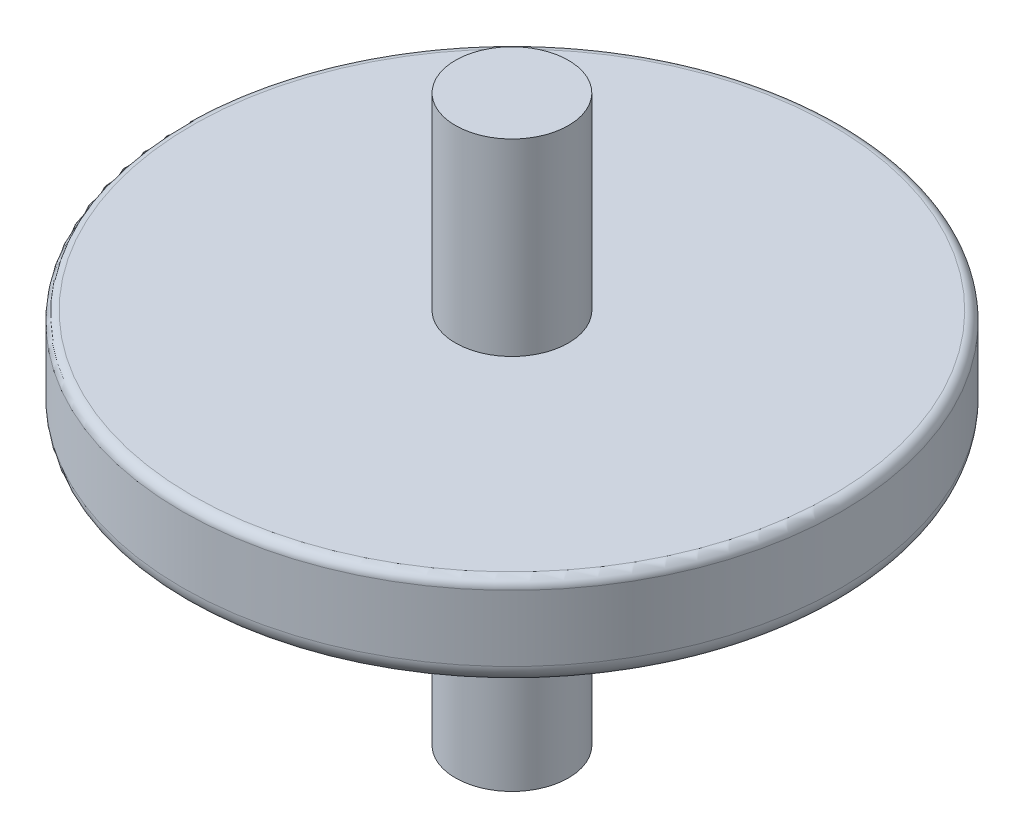
ISO-10303-21;
HEADER;
FILE_DESCRIPTION(('STEP AP214'),'2;1');
FILE_NAME('part.step','',(''),(''),'','','');
FILE_SCHEMA(('AUTOMOTIVE_DESIGN { 1 0 10303 214 1 1 1 1 }'));
ENDSEC;
DATA;
#1=APPLICATION_CONTEXT('core data for automotive mechanical design processes');
#2=APPLICATION_PROTOCOL_DEFINITION('international standard','automotive_design',2000,#1);
#3=PRODUCT_CONTEXT('',#1,'mechanical');
#4=PRODUCT('Part','Part','',(#3));
#5=PRODUCT_RELATED_PRODUCT_CATEGORY('part','',(#4));
#6=PRODUCT_DEFINITION_FORMATION('','',#4);
#7=PRODUCT_DEFINITION_CONTEXT('part definition',#1,'design');
#8=PRODUCT_DEFINITION('design','',#6,#7);
#9=PRODUCT_DEFINITION_SHAPE('','',#8);
#10=(LENGTH_UNIT() NAMED_UNIT(*) SI_UNIT(.MILLI.,.METRE.));
#11=(NAMED_UNIT(*) PLANE_ANGLE_UNIT() SI_UNIT($,.RADIAN.));
#12=(NAMED_UNIT(*) SI_UNIT($,.STERADIAN.) SOLID_ANGLE_UNIT());
#13=UNCERTAINTY_MEASURE_WITH_UNIT(LENGTH_MEASURE(1.E-05),#10,'distance_accuracy_value','');
#14=(GEOMETRIC_REPRESENTATION_CONTEXT(3) GLOBAL_UNCERTAINTY_ASSIGNED_CONTEXT((#13)) GLOBAL_UNIT_ASSIGNED_CONTEXT((#10,
#11,#12)) REPRESENTATION_CONTEXT('',''));
#15=CARTESIAN_POINT('',(0.,0.,0.));
#16=DIRECTION('',(0.,0.,1.));
#17=DIRECTION('',(1.,0.,0.));
#18=AXIS2_PLACEMENT_3D('',#15,#16,#17);
#19=CARTESIAN_POINT('',(0.,15.,0.));
#20=DIRECTION('',(0.,-1.,0.));
#21=DIRECTION('',(0.,0.,-1.));
#22=AXIS2_PLACEMENT_3D('',#19,#20,#21);
#23=CYLINDRICAL_SURFACE('',#22,3.);
#24=CARTESIAN_POINT('',(0.,15.,0.));
#25=DIRECTION('',(0.,1.,0.));
#26=DIRECTION('',(0.,0.,1.));
#27=AXIS2_PLACEMENT_3D('',#24,#25,#26);
#28=CIRCLE('',#27,3.);
#29=CARTESIAN_POINT('',(0.,15.,3.));
#30=VERTEX_POINT('',#29);
#31=EDGE_CURVE('E68',#30,#30,#28,.T.);
#32=ORIENTED_EDGE('',*,*,#31,.F.);
#33=EDGE_LOOP('',(#32));
#34=FACE_BOUND('',#33,.T.);
#35=CARTESIAN_POINT('',(0.,0.,0.));
#36=DIRECTION('',(0.,1.,0.));
#37=DIRECTION('',(0.,0.,1.));
#38=AXIS2_PLACEMENT_3D('',#35,#36,#37);
#39=CIRCLE('',#38,3.);
#40=CARTESIAN_POINT('',(0.,0.,3.));
#41=VERTEX_POINT('',#40);
#42=EDGE_CURVE('E64',#41,#41,#39,.T.);
#43=ORIENTED_EDGE('',*,*,#42,.T.);
#44=EDGE_LOOP('',(#43));
#45=FACE_BOUND('',#44,.T.);
#46=ADVANCED_FACE('F39',(#34,#45),#23,.T.);
#47=CARTESIAN_POINT('',(0.,0.,0.));
#48=DIRECTION('',(0.,1.,0.));
#49=DIRECTION('',(0.,0.,1.));
#50=AXIS2_PLACEMENT_3D('',#47,#48,#49);
#51=PLANE('',#50);
#52=ORIENTED_EDGE('',*,*,#42,.F.);
#53=EDGE_LOOP('',(#52));
#54=FACE_BOUND('',#53,.T.);
#55=ADVANCED_FACE('F99',(#54),#51,.F.);
#56=CARTESIAN_POINT('',(0.,20.,0.));
#57=DIRECTION('',(0.,-1.,0.));
#58=DIRECTION('',(0.,0.,-1.));
#59=AXIS2_PLACEMENT_3D('',#56,#57,#58);
#60=CYLINDRICAL_SURFACE('',#59,17.5);
#61=CARTESIAN_POINT('',(0.,19.5,0.));
#62=DIRECTION('',(0.,1.,0.));
#63=DIRECTION('',(0.,0.,1.));
#64=AXIS2_PLACEMENT_3D('',#61,#62,#63);
#65=CIRCLE('',#64,17.5);
#66=CARTESIAN_POINT('',(0.,19.5,17.5));
#67=VERTEX_POINT('',#66);
#68=EDGE_CURVE('E10',#67,#67,#65,.F.);
#69=ORIENTED_EDGE('',*,*,#68,.T.);
#70=EDGE_LOOP('',(#69));
#71=FACE_BOUND('',#70,.T.);
#72=CARTESIAN_POINT('',(0.,16.,0.));
#73=DIRECTION('',(0.,1.,0.));
#74=DIRECTION('',(0.,0.,1.));
#75=AXIS2_PLACEMENT_3D('',#72,#73,#74);
#76=CIRCLE('',#75,17.5);
#77=CARTESIAN_POINT('',(0.,16.,17.5));
#78=VERTEX_POINT('',#77);
#79=EDGE_CURVE('E57',#78,#78,#76,.T.);
#80=ORIENTED_EDGE('',*,*,#79,.T.);
#81=EDGE_LOOP('',(#80));
#82=FACE_BOUND('',#81,.T.);
#83=ADVANCED_FACE('F91',(#71,#82),#60,.T.);
#84=CARTESIAN_POINT('',(0.,20.,0.));
#85=DIRECTION('',(0.,1.,0.));
#86=DIRECTION('',(0.,0.,1.));
#87=AXIS2_PLACEMENT_3D('',#84,#85,#86);
#88=PLANE('',#87);
#89=CARTESIAN_POINT('',(0.,20.,0.));
#90=DIRECTION('',(0.,1.,0.));
#91=DIRECTION('',(0.,0.,1.));
#92=AXIS2_PLACEMENT_3D('',#89,#90,#91);
#93=CIRCLE('',#92,17.);
#94=CARTESIAN_POINT('',(0.,20.,17.));
#95=VERTEX_POINT('',#94);
#96=EDGE_CURVE('E47',#95,#95,#93,.T.);
#97=ORIENTED_EDGE('',*,*,#96,.T.);
#98=EDGE_LOOP('',(#97));
#99=FACE_BOUND('',#98,.T.);
#100=CARTESIAN_POINT('',(0.,20.,0.));
#101=DIRECTION('',(0.,1.,0.));
#102=DIRECTION('',(0.,0.,1.));
#103=AXIS2_PLACEMENT_3D('',#100,#101,#102);
#104=CIRCLE('',#103,3.);
#105=CARTESIAN_POINT('',(0.,20.,3.));
#106=VERTEX_POINT('',#105);
#107=EDGE_CURVE('E63',#106,#106,#104,.T.);
#108=ORIENTED_EDGE('',*,*,#107,.F.);
#109=EDGE_LOOP('',(#108));
#110=FACE_BOUND('',#109,.T.);
#111=ADVANCED_FACE('F89',(#99,#110),#88,.T.);
#112=CARTESIAN_POINT('',(0.,15.,0.));
#113=DIRECTION('',(0.,1.,0.));
#114=DIRECTION('',(0.,0.,1.));
#115=AXIS2_PLACEMENT_3D('',#112,#113,#114);
#116=PLANE('',#115);
#117=CARTESIAN_POINT('',(0.,15.,0.));
#118=DIRECTION('',(0.,1.,0.));
#119=DIRECTION('',(0.,0.,1.));
#120=AXIS2_PLACEMENT_3D('',#117,#118,#119);
#121=CIRCLE('',#120,16.5);
#122=CARTESIAN_POINT('',(0.,15.,16.5));
#123=VERTEX_POINT('',#122);
#124=EDGE_CURVE('E52',#123,#123,#121,.F.);
#125=ORIENTED_EDGE('',*,*,#124,.T.);
#126=EDGE_LOOP('',(#125));
#127=FACE_BOUND('',#126,.T.);
#128=ORIENTED_EDGE('',*,*,#31,.T.);
#129=EDGE_LOOP('',(#128));
#130=FACE_BOUND('',#129,.T.);
#131=ADVANCED_FACE('F85',(#127,#130),#116,.F.);
#132=CARTESIAN_POINT('',(0.,30.,0.));
#133=DIRECTION('',(0.,-1.,0.));
#134=DIRECTION('',(0.,0.,-1.));
#135=AXIS2_PLACEMENT_3D('',#132,#133,#134);
#136=CYLINDRICAL_SURFACE('',#135,3.);
#137=CARTESIAN_POINT('',(0.,30.,0.));
#138=DIRECTION('',(0.,1.,0.));
#139=DIRECTION('',(0.,0.,1.));
#140=AXIS2_PLACEMENT_3D('',#137,#138,#139);
#141=CIRCLE('',#140,3.);
#142=CARTESIAN_POINT('',(0.,30.,3.));
#143=VERTEX_POINT('',#142);
#144=EDGE_CURVE('E69',#143,#143,#141,.T.);
#145=ORIENTED_EDGE('',*,*,#144,.F.);
#146=EDGE_LOOP('',(#145));
#147=FACE_BOUND('',#146,.T.);
#148=ORIENTED_EDGE('',*,*,#107,.T.);
#149=EDGE_LOOP('',(#148));
#150=FACE_BOUND('',#149,.T.);
#151=ADVANCED_FACE('F82',(#147,#150),#136,.T.);
#152=CARTESIAN_POINT('',(0.,30.,0.));
#153=DIRECTION('',(0.,1.,0.));
#154=DIRECTION('',(0.,0.,1.));
#155=AXIS2_PLACEMENT_3D('',#152,#153,#154);
#156=PLANE('',#155);
#157=ORIENTED_EDGE('',*,*,#144,.T.);
#158=EDGE_LOOP('',(#157));
#159=FACE_BOUND('',#158,.T.);
#160=ADVANCED_FACE('F80',(#159),#156,.T.);
#161=CARTESIAN_POINT('',(0.,16.,0.));
#162=DIRECTION('',(0.,1.,0.));
#163=DIRECTION('',(0.,0.,1.));
#164=AXIS2_PLACEMENT_3D('',#161,#162,#163);
#165=TOROIDAL_SURFACE('',#164,16.5,1.);
#166=ORIENTED_EDGE('',*,*,#124,.F.);
#167=EDGE_LOOP('',(#166));
#168=FACE_BOUND('',#167,.T.);
#169=ORIENTED_EDGE('',*,*,#79,.F.);
#170=EDGE_LOOP('',(#169));
#171=FACE_BOUND('',#170,.T.);
#172=ADVANCED_FACE('F111',(#168,#171),#165,.T.);
#173=CARTESIAN_POINT('',(0.,19.5,0.));
#174=DIRECTION('',(0.,1.,0.));
#175=DIRECTION('',(0.,0.,1.));
#176=AXIS2_PLACEMENT_3D('',#173,#174,#175);
#177=TOROIDAL_SURFACE('',#176,17.,0.5);
#178=ORIENTED_EDGE('',*,*,#68,.F.);
#179=EDGE_LOOP('',(#178));
#180=FACE_BOUND('',#179,.T.);
#181=ORIENTED_EDGE('',*,*,#96,.F.);
#182=EDGE_LOOP('',(#181));
#183=FACE_BOUND('',#182,.T.);
#184=ADVANCED_FACE('F41',(#180,#183),#177,.T.);
#185=CLOSED_SHELL('',(#46,#55,#83,#111,#131,#151,#160,#172,#184));
#186=MANIFOLD_SOLID_BREP('B2',#185);
#187=ADVANCED_BREP_SHAPE_REPRESENTATION('',(#18,#186),#14);
#188=SHAPE_DEFINITION_REPRESENTATION(#9,#187);
ENDSEC;
END-ISO-10303-21;
